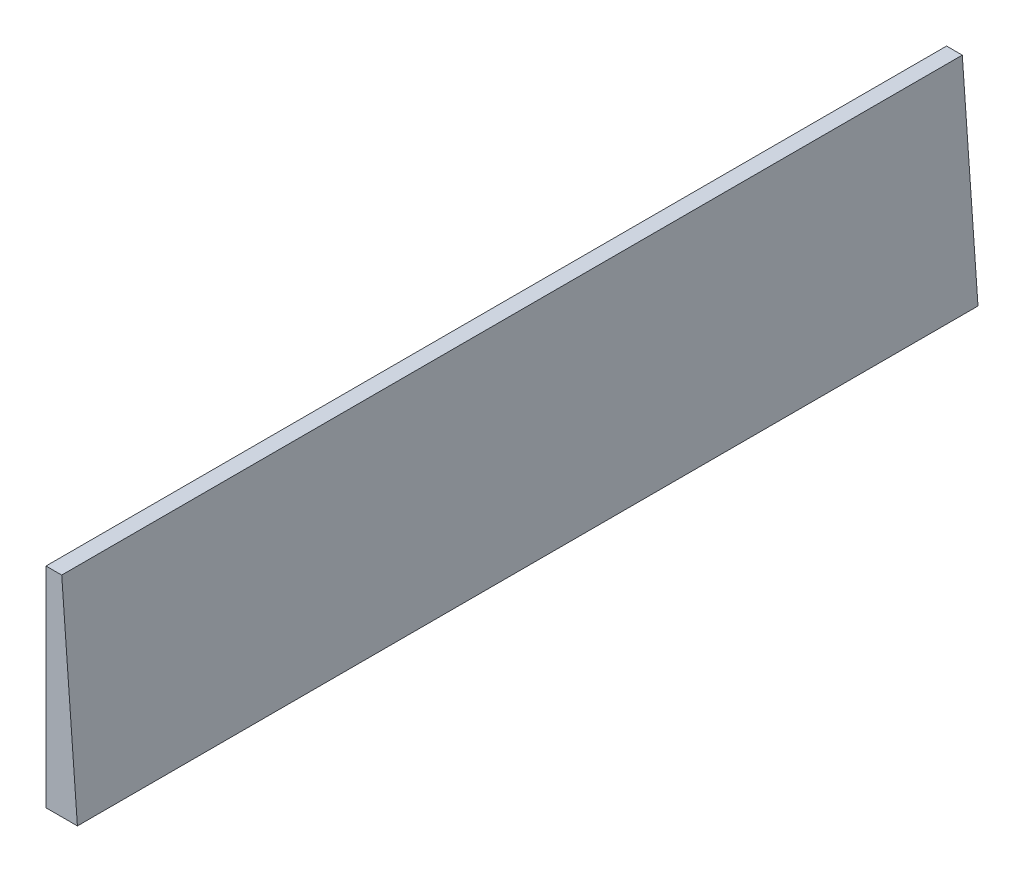
ISO-10303-21;
HEADER;
FILE_DESCRIPTION(('STEP AP214'),'2;1');
FILE_NAME('part.step','',(''),(''),'','','');
FILE_SCHEMA(('AUTOMOTIVE_DESIGN { 1 0 10303 214 1 1 1 1 }'));
ENDSEC;
DATA;
#1=APPLICATION_CONTEXT('core data for automotive mechanical design processes');
#2=APPLICATION_PROTOCOL_DEFINITION('international standard','automotive_design',2000,#1);
#3=PRODUCT_CONTEXT('',#1,'mechanical');
#4=PRODUCT('Part','Part','',(#3));
#5=PRODUCT_RELATED_PRODUCT_CATEGORY('part','',(#4));
#6=PRODUCT_DEFINITION_FORMATION('','',#4);
#7=PRODUCT_DEFINITION_CONTEXT('part definition',#1,'design');
#8=PRODUCT_DEFINITION('design','',#6,#7);
#9=PRODUCT_DEFINITION_SHAPE('','',#8);
#10=(LENGTH_UNIT() NAMED_UNIT(*) SI_UNIT(.MILLI.,.METRE.));
#11=(NAMED_UNIT(*) PLANE_ANGLE_UNIT() SI_UNIT($,.RADIAN.));
#12=(NAMED_UNIT(*) SI_UNIT($,.STERADIAN.) SOLID_ANGLE_UNIT());
#13=UNCERTAINTY_MEASURE_WITH_UNIT(LENGTH_MEASURE(1.E-05),#10,'distance_accuracy_value','');
#14=(GEOMETRIC_REPRESENTATION_CONTEXT(3) GLOBAL_UNCERTAINTY_ASSIGNED_CONTEXT((#13)) GLOBAL_UNIT_ASSIGNED_CONTEXT((#10,
#11,#12)) REPRESENTATION_CONTEXT('',''));
#15=CARTESIAN_POINT('',(0.,0.,0.));
#16=DIRECTION('',(0.,0.,1.));
#17=DIRECTION('',(1.,0.,0.));
#18=AXIS2_PLACEMENT_3D('',#15,#16,#17);
#19=CARTESIAN_POINT('',(0.,-3.33066907387547E-12,-4299.99999999998));
#20=DIRECTION('',(-1.,0.,0.));
#21=DIRECTION('',(0.,0.,0.999999999999992));
#22=AXIS2_PLACEMENT_3D('',#19,#20,#21);
#23=PLANE('',#22);
#24=DIRECTION('',(0.,0.,0.999999999999992));
#25=VECTOR('',#24,1.);
#26=CARTESIAN_POINT('',(8.88178419700125E-13,-1000.,-4299.99999999995));
#27=LINE('',#26,#25);
#28=CARTESIAN_POINT('',(8.88178419700125E-13,-1000.,-4299.99999999995));
#29=VERTEX_POINT('',#28);
#30=CARTESIAN_POINT('',(1.77635683940025E-12,-999.999999999996,4299.99999999999));
#31=VERTEX_POINT('',#30);
#32=EDGE_CURVE('E44',#29,#31,#27,.T.);
#33=ORIENTED_EDGE('',*,*,#32,.T.);
#34=DIRECTION('',(0.,-1.,0.));
#35=VECTOR('',#34,1.);
#36=CARTESIAN_POINT('',(0.,6.88338275267597E-12,4299.99999999999));
#37=LINE('',#36,#35);
#38=CARTESIAN_POINT('',(0.,1000.00000000001,4299.99999999999));
#39=VERTEX_POINT('',#38);
#40=EDGE_CURVE('E85',#39,#31,#37,.T.);
#41=ORIENTED_EDGE('',*,*,#40,.F.);
#42=DIRECTION('',(0.,0.,0.999999999999992));
#43=VECTOR('',#42,1.);
#44=CARTESIAN_POINT('',(0.,1000.,-4299.99999999997));
#45=LINE('',#44,#43);
#46=CARTESIAN_POINT('',(0.,1000.,-4299.99999999997));
#47=VERTEX_POINT('',#46);
#48=EDGE_CURVE('E11',#47,#39,#45,.T.);
#49=ORIENTED_EDGE('',*,*,#48,.F.);
#50=DIRECTION('',(0.,-1.,0.));
#51=VECTOR('',#50,1.);
#52=CARTESIAN_POINT('',(0.,-3.33066907387547E-12,-4299.99999999998));
#53=LINE('',#52,#51);
#54=EDGE_CURVE('E58',#47,#29,#53,.T.);
#55=ORIENTED_EDGE('',*,*,#54,.T.);
#56=EDGE_LOOP('',(#33,#41,#49,#55));
#57=FACE_BOUND('',#56,.T.);
#58=ADVANCED_FACE('F40',(#57),#23,.T.);
#59=CARTESIAN_POINT('',(0.,1000.,-4299.99999999997));
#60=DIRECTION('',(0.,1.,0.));
#61=DIRECTION('',(0.,0.,0.999999999999992));
#62=AXIS2_PLACEMENT_3D('',#59,#60,#61);
#63=PLANE('',#62);
#64=ORIENTED_EDGE('',*,*,#48,.T.);
#65=DIRECTION('',(-1.,0.,0.));
#66=VECTOR('',#65,1.);
#67=CARTESIAN_POINT('',(0.,1000.00000000001,4299.99999999999));
#68=LINE('',#67,#66);
#69=CARTESIAN_POINT('',(149.999999999999,1000.00000000001,4299.99999999999));
#70=VERTEX_POINT('',#69);
#71=EDGE_CURVE('E101',#70,#39,#68,.T.);
#72=ORIENTED_EDGE('',*,*,#71,.F.);
#73=DIRECTION('',(0.,0.,0.999999999999992));
#74=VECTOR('',#73,1.);
#75=CARTESIAN_POINT('',(150.,999.999999999999,-4299.99999999997));
#76=LINE('',#75,#74);
#77=CARTESIAN_POINT('',(150.,999.999999999999,-4299.99999999997));
#78=VERTEX_POINT('',#77);
#79=EDGE_CURVE('E50',#78,#70,#76,.T.);
#80=ORIENTED_EDGE('',*,*,#79,.F.);
#81=DIRECTION('',(-1.,0.,0.));
#82=VECTOR('',#81,1.);
#83=CARTESIAN_POINT('',(0.,1000.,-4299.99999999997));
#84=LINE('',#83,#82);
#85=EDGE_CURVE('E91',#78,#47,#84,.T.);
#86=ORIENTED_EDGE('',*,*,#85,.T.);
#87=EDGE_LOOP('',(#64,#72,#80,#86));
#88=FACE_BOUND('',#87,.T.);
#89=ADVANCED_FACE('F137',(#88),#63,.T.);
#90=CARTESIAN_POINT('',(300.000000000001,-1000.00000000001,-4299.99999999999));
#91=DIRECTION('',(0.997199309888452,0.0747899482416307,0.));
#92=DIRECTION('',(-0.0747899482416345,0.997199309888458,0.));
#93=AXIS2_PLACEMENT_3D('',#90,#91,#92);
#94=PLANE('',#93);
#95=ORIENTED_EDGE('',*,*,#79,.T.);
#96=DIRECTION('',(-0.0747899482416342,0.997199309888458,0.));
#97=VECTOR('',#96,1.);
#98=CARTESIAN_POINT('',(300.000000000001,-999.999999999995,4299.99999999998));
#99=LINE('',#98,#97);
#100=CARTESIAN_POINT('',(300.000000000001,-999.999999999995,4299.99999999998));
#101=VERTEX_POINT('',#100);
#102=EDGE_CURVE('E98',#101,#70,#99,.T.);
#103=ORIENTED_EDGE('',*,*,#102,.F.);
#104=DIRECTION('',(0.,0.,0.999999999999992));
#105=VECTOR('',#104,1.);
#106=CARTESIAN_POINT('',(300.000000000001,-1000.00000000001,-4299.99999999999));
#107=LINE('',#106,#105);
#108=CARTESIAN_POINT('',(300.000000000001,-1000.00000000001,-4299.99999999999));
#109=VERTEX_POINT('',#108);
#110=EDGE_CURVE('E90',#109,#101,#107,.T.);
#111=ORIENTED_EDGE('',*,*,#110,.F.);
#112=DIRECTION('',(-0.0747899482416342,0.997199309888458,0.));
#113=VECTOR('',#112,1.);
#114=CARTESIAN_POINT('',(300.000000000001,-1000.00000000001,-4299.99999999999));
#115=LINE('',#114,#113);
#116=EDGE_CURVE('E115',#109,#78,#115,.T.);
#117=ORIENTED_EDGE('',*,*,#116,.T.);
#118=EDGE_LOOP('',(#95,#103,#111,#117));
#119=FACE_BOUND('',#118,.T.);
#120=ADVANCED_FACE('F135',(#119),#94,.T.);
#121=CARTESIAN_POINT('',(8.88178419700125E-13,-1000.,-4299.99999999995));
#122=DIRECTION('',(0.,-1.,0.));
#123=DIRECTION('',(0.,0.,-0.999999999999992));
#124=AXIS2_PLACEMENT_3D('',#121,#122,#123);
#125=PLANE('',#124);
#126=ORIENTED_EDGE('',*,*,#110,.T.);
#127=DIRECTION('',(1.,0.,0.));
#128=VECTOR('',#127,1.);
#129=CARTESIAN_POINT('',(1.77635683940025E-12,-999.999999999996,4299.99999999999));
#130=LINE('',#129,#128);
#131=EDGE_CURVE('E93',#31,#101,#130,.T.);
#132=ORIENTED_EDGE('',*,*,#131,.F.);
#133=ORIENTED_EDGE('',*,*,#32,.F.);
#134=DIRECTION('',(1.,0.,0.));
#135=VECTOR('',#134,1.);
#136=CARTESIAN_POINT('',(8.88178419700125E-13,-1000.,-4299.99999999995));
#137=LINE('',#136,#135);
#138=EDGE_CURVE('E112',#29,#109,#137,.T.);
#139=ORIENTED_EDGE('',*,*,#138,.T.);
#140=EDGE_LOOP('',(#126,#132,#133,#139));
#141=FACE_BOUND('',#140,.T.);
#142=ADVANCED_FACE('F42',(#141),#125,.T.);
#143=CARTESIAN_POINT('',(0.,-3.33066907387547E-12,-4299.99999999998));
#144=DIRECTION('',(0.,0.,0.999999999999992));
#145=DIRECTION('',(1.,0.,0.));
#146=AXIS2_PLACEMENT_3D('',#143,#144,#145);
#147=PLANE('',#146);
#148=ORIENTED_EDGE('',*,*,#54,.F.);
#149=ORIENTED_EDGE('',*,*,#85,.F.);
#150=ORIENTED_EDGE('',*,*,#116,.F.);
#151=ORIENTED_EDGE('',*,*,#138,.F.);
#152=EDGE_LOOP('',(#148,#149,#150,#151));
#153=FACE_BOUND('',#152,.T.);
#154=ADVANCED_FACE('F138',(#153),#147,.F.);
#155=CARTESIAN_POINT('',(0.,6.88338275267597E-12,4299.99999999999));
#156=DIRECTION('',(0.,0.,0.999999999999992));
#157=DIRECTION('',(1.,0.,0.));
#158=AXIS2_PLACEMENT_3D('',#155,#156,#157);
#159=PLANE('',#158);
#160=ORIENTED_EDGE('',*,*,#40,.T.);
#161=ORIENTED_EDGE('',*,*,#131,.T.);
#162=ORIENTED_EDGE('',*,*,#102,.T.);
#163=ORIENTED_EDGE('',*,*,#71,.T.);
#164=EDGE_LOOP('',(#160,#161,#162,#163));
#165=FACE_BOUND('',#164,.T.);
#166=ADVANCED_FACE('F100',(#165),#159,.T.);
#167=CLOSED_SHELL('',(#58,#89,#120,#142,#154,#166));
#168=MANIFOLD_SOLID_BREP('B2',#167);
#169=ADVANCED_BREP_SHAPE_REPRESENTATION('',(#18,#168),#14);
#170=SHAPE_DEFINITION_REPRESENTATION(#9,#169);
ENDSEC;
END-ISO-10303-21;
